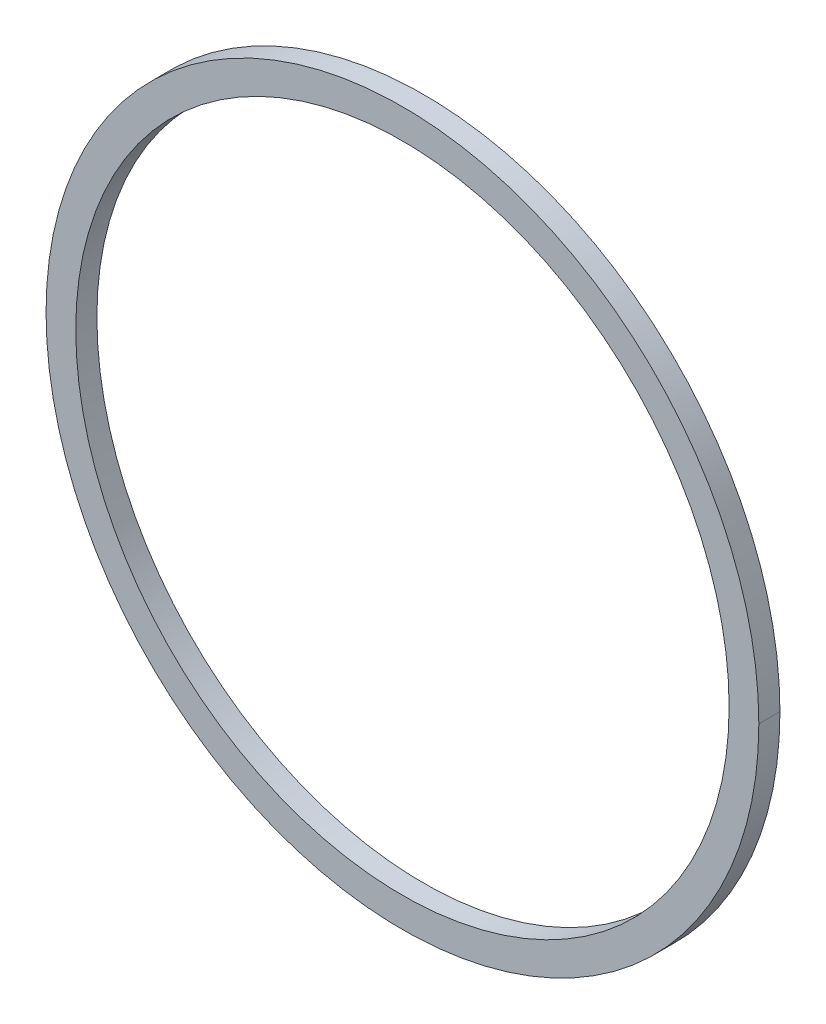
ISO-10303-21;
HEADER;
FILE_DESCRIPTION(('STEP AP214'),'2;1');
FILE_NAME('part.step','',(''),(''),'','','');
FILE_SCHEMA(('AUTOMOTIVE_DESIGN { 1 0 10303 214 1 1 1 1 }'));
ENDSEC;
DATA;
#1=APPLICATION_CONTEXT('core data for automotive mechanical design processes');
#2=APPLICATION_PROTOCOL_DEFINITION('international standard','automotive_design',2000,#1);
#3=PRODUCT_CONTEXT('',#1,'mechanical');
#4=PRODUCT('Part','Part','',(#3));
#5=PRODUCT_RELATED_PRODUCT_CATEGORY('part','',(#4));
#6=PRODUCT_DEFINITION_FORMATION('','',#4);
#7=PRODUCT_DEFINITION_CONTEXT('part definition',#1,'design');
#8=PRODUCT_DEFINITION('design','',#6,#7);
#9=PRODUCT_DEFINITION_SHAPE('','',#8);
#10=(LENGTH_UNIT() NAMED_UNIT(*) SI_UNIT(.MILLI.,.METRE.));
#11=(NAMED_UNIT(*) PLANE_ANGLE_UNIT() SI_UNIT($,.RADIAN.));
#12=(NAMED_UNIT(*) SI_UNIT($,.STERADIAN.) SOLID_ANGLE_UNIT());
#13=UNCERTAINTY_MEASURE_WITH_UNIT(LENGTH_MEASURE(1.E-05),#10,'distance_accuracy_value','');
#14=(GEOMETRIC_REPRESENTATION_CONTEXT(3) GLOBAL_UNCERTAINTY_ASSIGNED_CONTEXT((#13)) GLOBAL_UNIT_ASSIGNED_CONTEXT((#10,
#11,#12)) REPRESENTATION_CONTEXT('',''));
#15=CARTESIAN_POINT('',(0.,0.,0.));
#16=DIRECTION('',(0.,0.,1.));
#17=DIRECTION('',(1.,0.,0.));
#18=AXIS2_PLACEMENT_3D('',#15,#16,#17);
#19=CARTESIAN_POINT('',(97.3041488,70.58004426,0.));
#20=DIRECTION('',(-1.,0.,0.));
#21=DIRECTION('',(0.,1.,0.));
#22=AXIS2_PLACEMENT_3D('',#19,#20,#21);
#23=PLANE('',#22);
#24=DIRECTION('',(0.,1.,0.));
#25=VECTOR('',#24,1.);
#26=CARTESIAN_POINT('',(97.3041488,70.58004426,0.03556));
#27=LINE('',#26,#25);
#28=CARTESIAN_POINT('',(97.3041488,70.58004426,0.03556));
#29=VERTEX_POINT('',#28);
#30=CARTESIAN_POINT('',(97.3041488,70.5800468,0.03556));
#31=VERTEX_POINT('',#30);
#32=EDGE_CURVE('E11',#29,#31,#27,.T.);
#33=ORIENTED_EDGE('',*,*,#32,.F.);
#34=DIRECTION('',(0.,0.,1.));
#35=VECTOR('',#34,1.);
#36=CARTESIAN_POINT('',(97.3041488,70.58004426,0.));
#37=LINE('',#36,#35);
#38=CARTESIAN_POINT('',(97.3041488,70.58004426,0.));
#39=VERTEX_POINT('',#38);
#40=EDGE_CURVE('E24',#39,#29,#37,.T.);
#41=ORIENTED_EDGE('',*,*,#40,.F.);
#42=DIRECTION('',(0.,1.,0.));
#43=VECTOR('',#42,1.);
#44=CARTESIAN_POINT('',(97.3041488,70.58004426,0.));
#45=LINE('',#44,#43);
#46=CARTESIAN_POINT('',(97.3041488,70.5800468,0.));
#47=VERTEX_POINT('',#46);
#48=EDGE_CURVE('E96',#39,#47,#45,.T.);
#49=ORIENTED_EDGE('',*,*,#48,.T.);
#50=DIRECTION('',(0.,0.,1.));
#51=VECTOR('',#50,1.);
#52=CARTESIAN_POINT('',(97.3041488,70.5800468,0.));
#53=LINE('',#52,#51);
#54=EDGE_CURVE('E37',#47,#31,#53,.T.);
#55=ORIENTED_EDGE('',*,*,#54,.T.);
#56=EDGE_LOOP('',(#33,#41,#49,#55));
#57=FACE_BOUND('',#56,.T.);
#58=ADVANCED_FACE('F17',(#57),#23,.F.);
#59=CARTESIAN_POINT('',(96.70415,70.58004426,0.));
#60=DIRECTION('',(0.,0.,-1.));
#61=DIRECTION('',(-1.,0.,0.));
#62=AXIS2_PLACEMENT_3D('',#59,#60,#61);
#63=CYLINDRICAL_SURFACE('',#62,0.599998800000004);
#64=CARTESIAN_POINT('',(96.70415,70.58004426,0.03556));
#65=DIRECTION('',(0.,0.,1.));
#66=DIRECTION('',(-1.,0.,0.));
#67=AXIS2_PLACEMENT_3D('',#64,#65,#66);
#68=CIRCLE('',#67,0.599998800000004);
#69=CARTESIAN_POINT('',(96.1041512,70.58004426,0.03556));
#70=VERTEX_POINT('',#69);
#71=EDGE_CURVE('E92',#70,#29,#68,.T.);
#72=ORIENTED_EDGE('',*,*,#71,.F.);
#73=DIRECTION('',(0.,0.,1.));
#74=VECTOR('',#73,1.);
#75=CARTESIAN_POINT('',(96.1041512,70.58004426,0.));
#76=LINE('',#75,#74);
#77=CARTESIAN_POINT('',(96.1041512,70.58004426,0.));
#78=VERTEX_POINT('',#77);
#79=EDGE_CURVE('E90',#78,#70,#76,.T.);
#80=ORIENTED_EDGE('',*,*,#79,.F.);
#81=CARTESIAN_POINT('',(96.70415,70.58004426,0.));
#82=DIRECTION('',(0.,0.,1.));
#83=DIRECTION('',(-1.,0.,0.));
#84=AXIS2_PLACEMENT_3D('',#81,#82,#83);
#85=CIRCLE('',#84,0.599998800000004);
#86=EDGE_CURVE('E88',#78,#39,#85,.T.);
#87=ORIENTED_EDGE('',*,*,#86,.T.);
#88=ORIENTED_EDGE('',*,*,#40,.T.);
#89=EDGE_LOOP('',(#72,#80,#87,#88));
#90=FACE_BOUND('',#89,.T.);
#91=ADVANCED_FACE('F111',(#90),#63,.T.);
#92=CARTESIAN_POINT('',(96.70415,70.5800468,0.));
#93=DIRECTION('',(0.,0.,-1.));
#94=DIRECTION('',(1.,0.,0.));
#95=AXIS2_PLACEMENT_3D('',#92,#93,#94);
#96=CYLINDRICAL_SURFACE('',#95,0.599998799999999);
#97=CARTESIAN_POINT('',(96.70415,70.5800468,0.03556));
#98=DIRECTION('',(0.,0.,1.));
#99=DIRECTION('',(1.,0.,0.));
#100=AXIS2_PLACEMENT_3D('',#97,#98,#99);
#101=CIRCLE('',#100,0.599998799999999);
#102=CARTESIAN_POINT('',(96.1041512,70.5800468,0.03556));
#103=VERTEX_POINT('',#102);
#104=EDGE_CURVE('E85',#31,#103,#101,.T.);
#105=ORIENTED_EDGE('',*,*,#104,.F.);
#106=ORIENTED_EDGE('',*,*,#54,.F.);
#107=CARTESIAN_POINT('',(96.70415,70.5800468,0.));
#108=DIRECTION('',(0.,0.,1.));
#109=DIRECTION('',(1.,0.,0.));
#110=AXIS2_PLACEMENT_3D('',#107,#108,#109);
#111=CIRCLE('',#110,0.599998799999999);
#112=CARTESIAN_POINT('',(96.1041512,70.5800468,0.));
#113=VERTEX_POINT('',#112);
#114=EDGE_CURVE('E82',#47,#113,#111,.T.);
#115=ORIENTED_EDGE('',*,*,#114,.T.);
#116=DIRECTION('',(0.,0.,1.));
#117=VECTOR('',#116,1.);
#118=CARTESIAN_POINT('',(96.1041512,70.5800468,0.));
#119=LINE('',#118,#117);
#120=EDGE_CURVE('E80',#113,#103,#119,.T.);
#121=ORIENTED_EDGE('',*,*,#120,.T.);
#122=EDGE_LOOP('',(#105,#106,#115,#121));
#123=FACE_BOUND('',#122,.T.);
#124=ADVANCED_FACE('F104',(#123),#96,.T.);
#125=CARTESIAN_POINT('',(96.1041512,70.5800468,0.));
#126=DIRECTION('',(1.,0.,0.));
#127=DIRECTION('',(0.,-1.,0.));
#128=AXIS2_PLACEMENT_3D('',#125,#126,#127);
#129=PLANE('',#128);
#130=DIRECTION('',(0.,-1.,0.));
#131=VECTOR('',#130,1.);
#132=CARTESIAN_POINT('',(96.1041512,70.5800468,0.03556));
#133=LINE('',#132,#131);
#134=EDGE_CURVE('E77',#103,#70,#133,.T.);
#135=ORIENTED_EDGE('',*,*,#134,.F.);
#136=ORIENTED_EDGE('',*,*,#120,.F.);
#137=DIRECTION('',(0.,-1.,0.));
#138=VECTOR('',#137,1.);
#139=CARTESIAN_POINT('',(96.1041512,70.5800468,0.));
#140=LINE('',#139,#138);
#141=EDGE_CURVE('E68',#113,#78,#140,.T.);
#142=ORIENTED_EDGE('',*,*,#141,.T.);
#143=ORIENTED_EDGE('',*,*,#79,.T.);
#144=EDGE_LOOP('',(#135,#136,#142,#143));
#145=FACE_BOUND('',#144,.T.);
#146=ADVANCED_FACE('F110',(#145),#129,.F.);
#147=CARTESIAN_POINT('',(96.70415,70.5800468,0.));
#148=DIRECTION('',(0.,0.,-1.));
#149=DIRECTION('',(1.,0.,0.));
#150=AXIS2_PLACEMENT_3D('',#147,#148,#149);
#151=CYLINDRICAL_SURFACE('',#150,0.5499989);
#152=DIRECTION('',(0.,0.,1.));
#153=VECTOR('',#152,1.);
#154=CARTESIAN_POINT('',(97.2541489,70.5800468,0.));
#155=LINE('',#154,#153);
#156=CARTESIAN_POINT('',(97.2541489,70.5800468,0.));
#157=VERTEX_POINT('',#156);
#158=CARTESIAN_POINT('',(97.2541489,70.5800468,0.03556));
#159=VERTEX_POINT('',#158);
#160=EDGE_CURVE('E62',#157,#159,#155,.T.);
#161=ORIENTED_EDGE('',*,*,#160,.T.);
#162=CARTESIAN_POINT('',(96.70415,70.5800468,0.03556));
#163=DIRECTION('',(0.,0.,1.));
#164=DIRECTION('',(1.,0.,0.));
#165=AXIS2_PLACEMENT_3D('',#162,#163,#164);
#166=CIRCLE('',#165,0.5499989);
#167=EDGE_CURVE('E67',#159,#159,#166,.T.);
#168=ORIENTED_EDGE('',*,*,#167,.T.);
#169=ORIENTED_EDGE('',*,*,#160,.F.);
#170=CARTESIAN_POINT('',(96.70415,70.5800468,0.));
#171=DIRECTION('',(0.,0.,1.));
#172=DIRECTION('',(1.,0.,0.));
#173=AXIS2_PLACEMENT_3D('',#170,#171,#172);
#174=CIRCLE('',#173,0.5499989);
#175=EDGE_CURVE('E65',#157,#157,#174,.T.);
#176=ORIENTED_EDGE('',*,*,#175,.F.);
#177=EDGE_LOOP('',(#161,#168,#169,#176));
#178=FACE_BOUND('',#177,.T.);
#179=ADVANCED_FACE('F64',(#178),#151,.F.);
#180=CARTESIAN_POINT('',(97.3041488,70.58004426,0.));
#181=DIRECTION('',(0.,0.,-1.));
#182=DIRECTION('',(-1.,0.,0.));
#183=AXIS2_PLACEMENT_3D('',#180,#181,#182);
#184=PLANE('',#183);
#185=ORIENTED_EDGE('',*,*,#48,.F.);
#186=ORIENTED_EDGE('',*,*,#86,.F.);
#187=ORIENTED_EDGE('',*,*,#141,.F.);
#188=ORIENTED_EDGE('',*,*,#114,.F.);
#189=EDGE_LOOP('',(#185,#186,#187,#188));
#190=FACE_BOUND('',#189,.T.);
#191=ORIENTED_EDGE('',*,*,#175,.T.);
#192=EDGE_LOOP('',(#191));
#193=FACE_BOUND('',#192,.T.);
#194=ADVANCED_FACE('F71',(#190,#193),#184,.T.);
#195=CARTESIAN_POINT('',(97.3041488,70.58004426,0.03556));
#196=DIRECTION('',(0.,0.,-1.));
#197=DIRECTION('',(-1.,0.,0.));
#198=AXIS2_PLACEMENT_3D('',#195,#196,#197);
#199=PLANE('',#198);
#200=ORIENTED_EDGE('',*,*,#134,.T.);
#201=ORIENTED_EDGE('',*,*,#71,.T.);
#202=ORIENTED_EDGE('',*,*,#32,.T.);
#203=ORIENTED_EDGE('',*,*,#104,.T.);
#204=EDGE_LOOP('',(#200,#201,#202,#203));
#205=FACE_BOUND('',#204,.T.);
#206=ORIENTED_EDGE('',*,*,#167,.F.);
#207=EDGE_LOOP('',(#206));
#208=FACE_BOUND('',#207,.T.);
#209=ADVANCED_FACE('F107',(#205,#208),#199,.F.);
#210=CLOSED_SHELL('',(#58,#91,#124,#146,#179,#194,#209));
#211=MANIFOLD_SOLID_BREP('B1',#210);
#212=ADVANCED_BREP_SHAPE_REPRESENTATION('',(#18,#211),#14);
#213=SHAPE_DEFINITION_REPRESENTATION(#9,#212);
ENDSEC;
END-ISO-10303-21;
